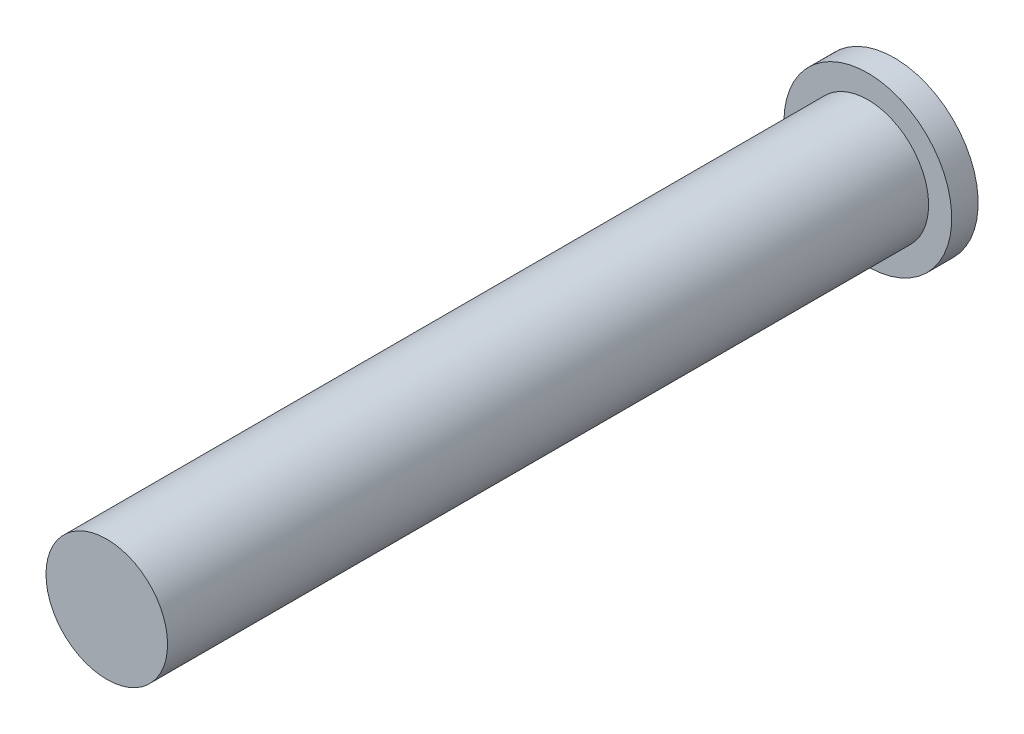
ISO-10303-21;
HEADER;
FILE_DESCRIPTION(('STEP AP214'),'2;1');
FILE_NAME('part.step','',(''),(''),'','','');
FILE_SCHEMA(('AUTOMOTIVE_DESIGN { 1 0 10303 214 1 1 1 1 }'));
ENDSEC;
DATA;
#1=APPLICATION_CONTEXT('core data for automotive mechanical design processes');
#2=APPLICATION_PROTOCOL_DEFINITION('international standard','automotive_design',2000,#1);
#3=PRODUCT_CONTEXT('',#1,'mechanical');
#4=PRODUCT('Part','Part','',(#3));
#5=PRODUCT_RELATED_PRODUCT_CATEGORY('part','',(#4));
#6=PRODUCT_DEFINITION_FORMATION('','',#4);
#7=PRODUCT_DEFINITION_CONTEXT('part definition',#1,'design');
#8=PRODUCT_DEFINITION('design','',#6,#7);
#9=PRODUCT_DEFINITION_SHAPE('','',#8);
#10=(LENGTH_UNIT() NAMED_UNIT(*) SI_UNIT(.MILLI.,.METRE.));
#11=(NAMED_UNIT(*) PLANE_ANGLE_UNIT() SI_UNIT($,.RADIAN.));
#12=(NAMED_UNIT(*) SI_UNIT($,.STERADIAN.) SOLID_ANGLE_UNIT());
#13=UNCERTAINTY_MEASURE_WITH_UNIT(LENGTH_MEASURE(1.E-05),#10,'distance_accuracy_value','');
#14=(GEOMETRIC_REPRESENTATION_CONTEXT(3) GLOBAL_UNCERTAINTY_ASSIGNED_CONTEXT((#13)) GLOBAL_UNIT_ASSIGNED_CONTEXT((#10,
#11,#12)) REPRESENTATION_CONTEXT('',''));
#15=CARTESIAN_POINT('',(0.,0.,0.));
#16=DIRECTION('',(0.,0.,1.));
#17=DIRECTION('',(1.,0.,0.));
#18=AXIS2_PLACEMENT_3D('',#15,#16,#17);
#19=CARTESIAN_POINT('',(0.,0.,72.));
#20=DIRECTION('',(0.,0.,-1.));
#21=DIRECTION('',(-1.,0.,0.));
#22=AXIS2_PLACEMENT_3D('',#19,#20,#21);
#23=CYLINDRICAL_SURFACE('',#22,11.5);
#24=CARTESIAN_POINT('',(0.,0.,72.));
#25=DIRECTION('',(0.,0.,1.));
#26=DIRECTION('',(1.,0.,0.));
#27=AXIS2_PLACEMENT_3D('',#24,#25,#26);
#28=CIRCLE('',#27,11.5);
#29=CARTESIAN_POINT('',(11.5,0.,72.));
#30=VERTEX_POINT('',#29);
#31=EDGE_CURVE('E10',#30,#30,#28,.T.);
#32=ORIENTED_EDGE('',*,*,#31,.F.);
#33=EDGE_LOOP('',(#32));
#34=FACE_BOUND('',#33,.T.);
#35=CARTESIAN_POINT('',(0.,0.,-72.));
#36=DIRECTION('',(0.,0.,-1.));
#37=DIRECTION('',(-1.,0.,0.));
#38=AXIS2_PLACEMENT_3D('',#35,#36,#37);
#39=CIRCLE('',#38,11.5);
#40=CARTESIAN_POINT('',(-11.5,0.,-72.));
#41=VERTEX_POINT('',#40);
#42=EDGE_CURVE('E37',#41,#41,#39,.T.);
#43=ORIENTED_EDGE('',*,*,#42,.F.);
#44=EDGE_LOOP('',(#43));
#45=FACE_BOUND('',#44,.T.);
#46=ADVANCED_FACE('F31',(#34,#45),#23,.T.);
#47=CARTESIAN_POINT('',(0.,0.,72.));
#48=DIRECTION('',(0.,0.,1.));
#49=DIRECTION('',(1.,0.,0.));
#50=AXIS2_PLACEMENT_3D('',#47,#48,#49);
#51=PLANE('',#50);
#52=ORIENTED_EDGE('',*,*,#31,.T.);
#53=EDGE_LOOP('',(#52));
#54=FACE_BOUND('',#53,.T.);
#55=ADVANCED_FACE('F64',(#54),#51,.T.);
#56=CARTESIAN_POINT('',(0.,0.,-77.));
#57=DIRECTION('',(0.,0.,1.));
#58=DIRECTION('',(1.,0.,0.));
#59=AXIS2_PLACEMENT_3D('',#56,#57,#58);
#60=CYLINDRICAL_SURFACE('',#59,15.875);
#61=CARTESIAN_POINT('',(0.,0.,-77.));
#62=DIRECTION('',(0.,0.,-1.));
#63=DIRECTION('',(-1.,0.,0.));
#64=AXIS2_PLACEMENT_3D('',#61,#62,#63);
#65=CIRCLE('',#64,15.875);
#66=CARTESIAN_POINT('',(-15.875,0.,-77.));
#67=VERTEX_POINT('',#66);
#68=EDGE_CURVE('E41',#67,#67,#65,.T.);
#69=ORIENTED_EDGE('',*,*,#68,.F.);
#70=EDGE_LOOP('',(#69));
#71=FACE_BOUND('',#70,.T.);
#72=CARTESIAN_POINT('',(0.,0.,-72.));
#73=DIRECTION('',(0.,0.,-1.));
#74=DIRECTION('',(-1.,0.,0.));
#75=AXIS2_PLACEMENT_3D('',#72,#73,#74);
#76=CIRCLE('',#75,15.875);
#77=CARTESIAN_POINT('',(-15.875,0.,-72.));
#78=VERTEX_POINT('',#77);
#79=EDGE_CURVE('E45',#78,#78,#76,.T.);
#80=ORIENTED_EDGE('',*,*,#79,.T.);
#81=EDGE_LOOP('',(#80));
#82=FACE_BOUND('',#81,.T.);
#83=ADVANCED_FACE('F51',(#71,#82),#60,.T.);
#84=CARTESIAN_POINT('',(0.,0.,-77.));
#85=DIRECTION('',(0.,0.,-1.));
#86=DIRECTION('',(-1.,0.,0.));
#87=AXIS2_PLACEMENT_3D('',#84,#85,#86);
#88=PLANE('',#87);
#89=ORIENTED_EDGE('',*,*,#68,.T.);
#90=EDGE_LOOP('',(#89));
#91=FACE_BOUND('',#90,.T.);
#92=ADVANCED_FACE('F55',(#91),#88,.T.);
#93=CARTESIAN_POINT('',(0.,0.,-72.));
#94=DIRECTION('',(0.,0.,-1.));
#95=DIRECTION('',(-1.,0.,0.));
#96=AXIS2_PLACEMENT_3D('',#93,#94,#95);
#97=PLANE('',#96);
#98=ORIENTED_EDGE('',*,*,#42,.T.);
#99=EDGE_LOOP('',(#98));
#100=FACE_BOUND('',#99,.T.);
#101=ORIENTED_EDGE('',*,*,#79,.F.);
#102=EDGE_LOOP('',(#101));
#103=FACE_BOUND('',#102,.T.);
#104=ADVANCED_FACE('F53',(#100,#103),#97,.F.);
#105=CLOSED_SHELL('',(#46,#55,#83,#92,#104));
#106=MANIFOLD_SOLID_BREP('B2',#105);
#107=ADVANCED_BREP_SHAPE_REPRESENTATION('',(#18,#106),#14);
#108=SHAPE_DEFINITION_REPRESENTATION(#9,#107);
ENDSEC;
END-ISO-10303-21;
